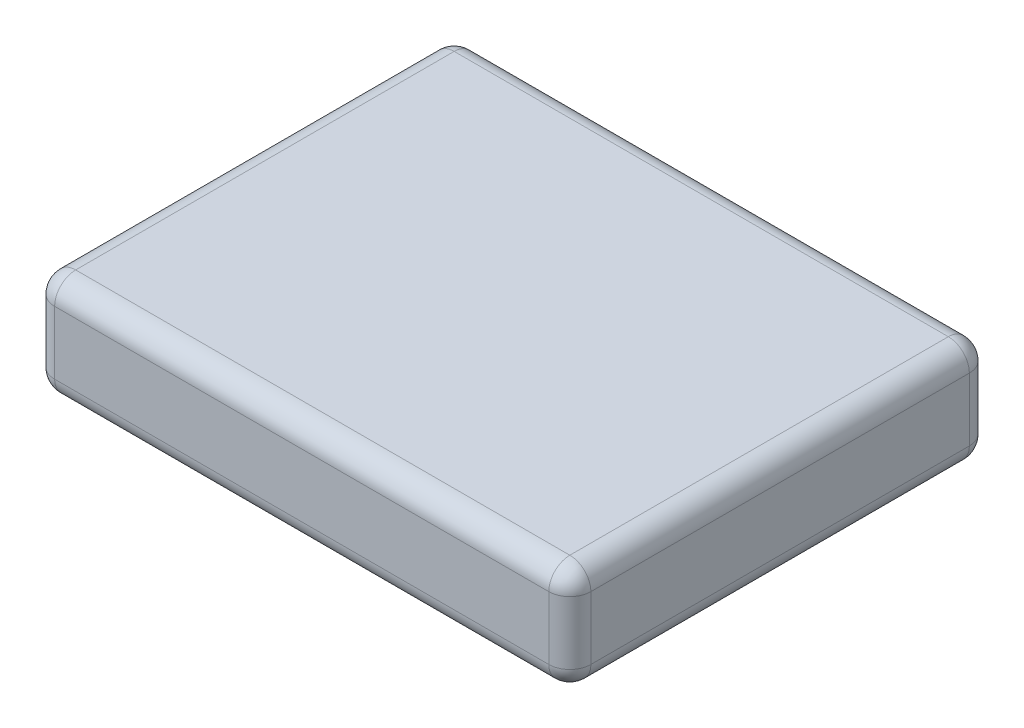
ISO-10303-21;
HEADER;
FILE_DESCRIPTION(('STEP AP214'),'2;1');
FILE_NAME('part.step','',(''),(''),'','','');
FILE_SCHEMA(('AUTOMOTIVE_DESIGN { 1 0 10303 214 1 1 1 1 }'));
ENDSEC;
DATA;
#1=APPLICATION_CONTEXT('core data for automotive mechanical design processes');
#2=APPLICATION_PROTOCOL_DEFINITION('international standard','automotive_design',2000,#1);
#3=PRODUCT_CONTEXT('',#1,'mechanical');
#4=PRODUCT('Part','Part','',(#3));
#5=PRODUCT_RELATED_PRODUCT_CATEGORY('part','',(#4));
#6=PRODUCT_DEFINITION_FORMATION('','',#4);
#7=PRODUCT_DEFINITION_CONTEXT('part definition',#1,'design');
#8=PRODUCT_DEFINITION('design','',#6,#7);
#9=PRODUCT_DEFINITION_SHAPE('','',#8);
#10=(LENGTH_UNIT() NAMED_UNIT(*) SI_UNIT(.MILLI.,.METRE.));
#11=(NAMED_UNIT(*) PLANE_ANGLE_UNIT() SI_UNIT($,.RADIAN.));
#12=(NAMED_UNIT(*) SI_UNIT($,.STERADIAN.) SOLID_ANGLE_UNIT());
#13=UNCERTAINTY_MEASURE_WITH_UNIT(LENGTH_MEASURE(1.E-05),#10,'distance_accuracy_value','');
#14=(GEOMETRIC_REPRESENTATION_CONTEXT(3) GLOBAL_UNCERTAINTY_ASSIGNED_CONTEXT((#13)) GLOBAL_UNIT_ASSIGNED_CONTEXT((#10,
#11,#12)) REPRESENTATION_CONTEXT('',''));
#15=CARTESIAN_POINT('',(0.,0.,0.));
#16=DIRECTION('',(0.,0.,1.));
#17=DIRECTION('',(1.,0.,0.));
#18=AXIS2_PLACEMENT_3D('',#15,#16,#17);
#19=CARTESIAN_POINT('',(12.75,5.,10.));
#20=DIRECTION('',(-1.,0.,0.));
#21=DIRECTION('',(0.,0.,1.));
#22=AXIS2_PLACEMENT_3D('',#19,#20,#21);
#23=PLANE('',#22);
#24=DIRECTION('',(0.,-1.,0.));
#25=VECTOR('',#24,1.);
#26=CARTESIAN_POINT('',(12.75,5.,9.));
#27=LINE('',#26,#25);
#28=CARTESIAN_POINT('',(12.75,4.,9.));
#29=VERTEX_POINT('',#28);
#30=CARTESIAN_POINT('',(12.75,1.,9.));
#31=VERTEX_POINT('',#30);
#32=EDGE_CURVE('E214',#29,#31,#27,.T.);
#33=ORIENTED_EDGE('',*,*,#32,.T.);
#34=DIRECTION('',(0.,0.,-1.));
#35=VECTOR('',#34,1.);
#36=CARTESIAN_POINT('',(12.75,1.,-10.));
#37=LINE('',#36,#35);
#38=CARTESIAN_POINT('',(12.75,1.,-9.));
#39=VERTEX_POINT('',#38);
#40=EDGE_CURVE('E218',#31,#39,#37,.T.);
#41=ORIENTED_EDGE('',*,*,#40,.T.);
#42=DIRECTION('',(0.,-1.,0.));
#43=VECTOR('',#42,1.);
#44=CARTESIAN_POINT('',(12.75,5.,-9.));
#45=LINE('',#44,#43);
#46=CARTESIAN_POINT('',(12.75,4.,-9.));
#47=VERTEX_POINT('',#46);
#48=EDGE_CURVE('E211',#39,#47,#45,.F.);
#49=ORIENTED_EDGE('',*,*,#48,.T.);
#50=DIRECTION('',(0.,0.,-1.));
#51=VECTOR('',#50,1.);
#52=CARTESIAN_POINT('',(12.75,4.,10.));
#53=LINE('',#52,#51);
#54=EDGE_CURVE('E208',#47,#29,#53,.F.);
#55=ORIENTED_EDGE('',*,*,#54,.T.);
#56=EDGE_LOOP('',(#33,#41,#49,#55));
#57=FACE_BOUND('',#56,.T.);
#58=ADVANCED_FACE('F45',(#57),#23,.F.);
#59=CARTESIAN_POINT('',(-12.75,5.,-10.));
#60=DIRECTION('',(0.,0.,1.));
#61=DIRECTION('',(1.,0.,0.));
#62=AXIS2_PLACEMENT_3D('',#59,#60,#61);
#63=PLANE('',#62);
#64=DIRECTION('',(0.,-1.,0.));
#65=VECTOR('',#64,1.);
#66=CARTESIAN_POINT('',(11.75,5.,-10.));
#67=LINE('',#66,#65);
#68=CARTESIAN_POINT('',(11.75,4.,-10.));
#69=VERTEX_POINT('',#68);
#70=CARTESIAN_POINT('',(11.75,1.,-10.));
#71=VERTEX_POINT('',#70);
#72=EDGE_CURVE('E187',#69,#71,#67,.T.);
#73=ORIENTED_EDGE('',*,*,#72,.T.);
#74=DIRECTION('',(-1.,0.,0.));
#75=VECTOR('',#74,1.);
#76=CARTESIAN_POINT('',(-12.75,1.,-10.));
#77=LINE('',#76,#75);
#78=CARTESIAN_POINT('',(-11.75,1.,-10.));
#79=VERTEX_POINT('',#78);
#80=EDGE_CURVE('E194',#71,#79,#77,.T.);
#81=ORIENTED_EDGE('',*,*,#80,.T.);
#82=DIRECTION('',(0.,-1.,0.));
#83=VECTOR('',#82,1.);
#84=CARTESIAN_POINT('',(-11.75,5.,-10.));
#85=LINE('',#84,#83);
#86=CARTESIAN_POINT('',(-11.75,4.,-10.));
#87=VERTEX_POINT('',#86);
#88=EDGE_CURVE('E190',#79,#87,#85,.F.);
#89=ORIENTED_EDGE('',*,*,#88,.T.);
#90=DIRECTION('',(-1.,0.,0.));
#91=VECTOR('',#90,1.);
#92=CARTESIAN_POINT('',(-12.75,4.,-10.));
#93=LINE('',#92,#91);
#94=EDGE_CURVE('E184',#87,#69,#93,.F.);
#95=ORIENTED_EDGE('',*,*,#94,.T.);
#96=EDGE_LOOP('',(#73,#81,#89,#95));
#97=FACE_BOUND('',#96,.T.);
#98=ADVANCED_FACE('F365',(#97),#63,.F.);
#99=CARTESIAN_POINT('',(-12.75,5.,10.));
#100=DIRECTION('',(1.,0.,0.));
#101=DIRECTION('',(0.,0.,-1.));
#102=AXIS2_PLACEMENT_3D('',#99,#100,#101);
#103=PLANE('',#102);
#104=DIRECTION('',(0.,-1.,0.));
#105=VECTOR('',#104,1.);
#106=CARTESIAN_POINT('',(-12.75,5.,-9.));
#107=LINE('',#106,#105);
#108=CARTESIAN_POINT('',(-12.75,4.,-9.));
#109=VERTEX_POINT('',#108);
#110=CARTESIAN_POINT('',(-12.75,1.,-9.));
#111=VERTEX_POINT('',#110);
#112=EDGE_CURVE('E146',#109,#111,#107,.T.);
#113=ORIENTED_EDGE('',*,*,#112,.T.);
#114=DIRECTION('',(0.,0.,1.));
#115=VECTOR('',#114,1.);
#116=CARTESIAN_POINT('',(-12.75,1.,10.));
#117=LINE('',#116,#115);
#118=CARTESIAN_POINT('',(-12.75,1.,9.));
#119=VERTEX_POINT('',#118);
#120=EDGE_CURVE('E141',#111,#119,#117,.T.);
#121=ORIENTED_EDGE('',*,*,#120,.T.);
#122=DIRECTION('',(0.,-1.,0.));
#123=VECTOR('',#122,1.);
#124=CARTESIAN_POINT('',(-12.75,5.,9.));
#125=LINE('',#124,#123);
#126=CARTESIAN_POINT('',(-12.75,4.,9.));
#127=VERTEX_POINT('',#126);
#128=EDGE_CURVE('E133',#119,#127,#125,.F.);
#129=ORIENTED_EDGE('',*,*,#128,.T.);
#130=DIRECTION('',(0.,0.,1.));
#131=VECTOR('',#130,1.);
#132=CARTESIAN_POINT('',(-12.75,4.,10.));
#133=LINE('',#132,#131);
#134=EDGE_CURVE('E138',#127,#109,#133,.F.);
#135=ORIENTED_EDGE('',*,*,#134,.T.);
#136=EDGE_LOOP('',(#113,#121,#129,#135));
#137=FACE_BOUND('',#136,.T.);
#138=ADVANCED_FACE('F136',(#137),#103,.F.);
#139=CARTESIAN_POINT('',(-12.75,5.,10.));
#140=DIRECTION('',(0.,0.,-1.));
#141=DIRECTION('',(-1.,0.,0.));
#142=AXIS2_PLACEMENT_3D('',#139,#140,#141);
#143=PLANE('',#142);
#144=DIRECTION('',(0.,-1.,0.));
#145=VECTOR('',#144,1.);
#146=CARTESIAN_POINT('',(-11.75,5.,10.));
#147=LINE('',#146,#145);
#148=CARTESIAN_POINT('',(-11.75,4.,10.));
#149=VERTEX_POINT('',#148);
#150=CARTESIAN_POINT('',(-11.75,1.,10.));
#151=VERTEX_POINT('',#150);
#152=EDGE_CURVE('E154',#149,#151,#147,.T.);
#153=ORIENTED_EDGE('',*,*,#152,.T.);
#154=DIRECTION('',(1.,0.,0.));
#155=VECTOR('',#154,1.);
#156=CARTESIAN_POINT('',(12.75,1.,10.));
#157=LINE('',#156,#155);
#158=CARTESIAN_POINT('',(11.75,1.,10.));
#159=VERTEX_POINT('',#158);
#160=EDGE_CURVE('E205',#151,#159,#157,.T.);
#161=ORIENTED_EDGE('',*,*,#160,.T.);
#162=DIRECTION('',(0.,-1.,0.));
#163=VECTOR('',#162,1.);
#164=CARTESIAN_POINT('',(11.75,5.,10.));
#165=LINE('',#164,#163);
#166=CARTESIAN_POINT('',(11.75,4.,10.));
#167=VERTEX_POINT('',#166);
#168=EDGE_CURVE('E200',#159,#167,#165,.F.);
#169=ORIENTED_EDGE('',*,*,#168,.T.);
#170=DIRECTION('',(1.,0.,0.));
#171=VECTOR('',#170,1.);
#172=CARTESIAN_POINT('',(-12.75,4.,10.));
#173=LINE('',#172,#171);
#174=EDGE_CURVE('E197',#167,#149,#173,.F.);
#175=ORIENTED_EDGE('',*,*,#174,.T.);
#176=EDGE_LOOP('',(#153,#161,#169,#175));
#177=FACE_BOUND('',#176,.T.);
#178=ADVANCED_FACE('F356',(#177),#143,.F.);
#179=CARTESIAN_POINT('',(0.,5.,0.));
#180=DIRECTION('',(0.,-1.,0.));
#181=DIRECTION('',(0.,0.,-1.));
#182=AXIS2_PLACEMENT_3D('',#179,#180,#181);
#183=PLANE('',#182);
#184=DIRECTION('',(0.,0.,1.));
#185=VECTOR('',#184,1.);
#186=CARTESIAN_POINT('',(-11.75,5.,0.));
#187=LINE('',#186,#185);
#188=CARTESIAN_POINT('',(-11.75,5.,-9.));
#189=VERTEX_POINT('',#188);
#190=CARTESIAN_POINT('',(-11.75,5.,9.));
#191=VERTEX_POINT('',#190);
#192=EDGE_CURVE('E55',#189,#191,#187,.T.);
#193=ORIENTED_EDGE('',*,*,#192,.T.);
#194=DIRECTION('',(1.,0.,0.));
#195=VECTOR('',#194,1.);
#196=CARTESIAN_POINT('',(0.,5.,9.));
#197=LINE('',#196,#195);
#198=CARTESIAN_POINT('',(11.75,5.,9.));
#199=VERTEX_POINT('',#198);
#200=EDGE_CURVE('E11',#191,#199,#197,.T.);
#201=ORIENTED_EDGE('',*,*,#200,.T.);
#202=DIRECTION('',(0.,0.,-1.));
#203=VECTOR('',#202,1.);
#204=CARTESIAN_POINT('',(11.75,5.,0.));
#205=LINE('',#204,#203);
#206=CARTESIAN_POINT('',(11.75,5.,-9.));
#207=VERTEX_POINT('',#206);
#208=EDGE_CURVE('E234',#199,#207,#205,.T.);
#209=ORIENTED_EDGE('',*,*,#208,.T.);
#210=DIRECTION('',(-1.,0.,0.));
#211=VECTOR('',#210,1.);
#212=CARTESIAN_POINT('',(0.,5.,-9.));
#213=LINE('',#212,#211);
#214=EDGE_CURVE('E66',#207,#189,#213,.T.);
#215=ORIENTED_EDGE('',*,*,#214,.T.);
#216=EDGE_LOOP('',(#193,#201,#209,#215));
#217=FACE_BOUND('',#216,.T.);
#218=ADVANCED_FACE('F358',(#217),#183,.F.);
#219=CARTESIAN_POINT('',(0.,0.,0.));
#220=DIRECTION('',(0.,-1.,0.));
#221=DIRECTION('',(0.,0.,-1.));
#222=AXIS2_PLACEMENT_3D('',#219,#220,#221);
#223=PLANE('',#222);
#224=DIRECTION('',(0.,0.,1.));
#225=VECTOR('',#224,1.);
#226=CARTESIAN_POINT('',(-11.75,0.,-10.));
#227=LINE('',#226,#225);
#228=CARTESIAN_POINT('',(-11.75,0.,9.));
#229=VERTEX_POINT('',#228);
#230=CARTESIAN_POINT('',(-11.75,0.,-9.));
#231=VERTEX_POINT('',#230);
#232=EDGE_CURVE('E227',#229,#231,#227,.F.);
#233=ORIENTED_EDGE('',*,*,#232,.T.);
#234=DIRECTION('',(-1.,0.,0.));
#235=VECTOR('',#234,1.);
#236=CARTESIAN_POINT('',(12.75,0.,-9.));
#237=LINE('',#236,#235);
#238=CARTESIAN_POINT('',(11.75,0.,-9.));
#239=VERTEX_POINT('',#238);
#240=EDGE_CURVE('E230',#231,#239,#237,.F.);
#241=ORIENTED_EDGE('',*,*,#240,.T.);
#242=DIRECTION('',(0.,0.,-1.));
#243=VECTOR('',#242,1.);
#244=CARTESIAN_POINT('',(11.75,0.,10.));
#245=LINE('',#244,#243);
#246=CARTESIAN_POINT('',(11.75,0.,9.));
#247=VERTEX_POINT('',#246);
#248=EDGE_CURVE('E221',#239,#247,#245,.F.);
#249=ORIENTED_EDGE('',*,*,#248,.T.);
#250=DIRECTION('',(1.,0.,0.));
#251=VECTOR('',#250,1.);
#252=CARTESIAN_POINT('',(-12.75,0.,9.));
#253=LINE('',#252,#251);
#254=EDGE_CURVE('E224',#247,#229,#253,.F.);
#255=ORIENTED_EDGE('',*,*,#254,.T.);
#256=EDGE_LOOP('',(#233,#241,#249,#255));
#257=FACE_BOUND('',#256,.T.);
#258=ADVANCED_FACE('F325',(#257),#223,.T.);
#259=CARTESIAN_POINT('',(11.75,5.,9.));
#260=DIRECTION('',(0.,-1.,0.));
#261=DIRECTION('',(0.,0.,-1.));
#262=AXIS2_PLACEMENT_3D('',#259,#260,#261);
#263=CYLINDRICAL_SURFACE('',#262,1.);
#264=CARTESIAN_POINT('',(11.75,4.,9.));
#265=DIRECTION('',(0.,1.,0.));
#266=DIRECTION('',(0.,0.,1.));
#267=AXIS2_PLACEMENT_3D('',#264,#265,#266);
#268=CIRCLE('',#267,1.);
#269=EDGE_CURVE('E49',#167,#29,#268,.T.);
#270=ORIENTED_EDGE('',*,*,#269,.F.);
#271=ORIENTED_EDGE('',*,*,#168,.F.);
#272=CARTESIAN_POINT('',(11.75,1.,9.));
#273=DIRECTION('',(0.,-1.,0.));
#274=DIRECTION('',(0.,0.,-1.));
#275=AXIS2_PLACEMENT_3D('',#272,#273,#274);
#276=CIRCLE('',#275,1.);
#277=EDGE_CURVE('E178',#31,#159,#276,.T.);
#278=ORIENTED_EDGE('',*,*,#277,.F.);
#279=ORIENTED_EDGE('',*,*,#32,.F.);
#280=EDGE_LOOP('',(#270,#271,#278,#279));
#281=FACE_BOUND('',#280,.T.);
#282=ADVANCED_FACE('F47',(#281),#263,.T.);
#283=CARTESIAN_POINT('',(11.75,4.,9.));
#284=DIRECTION('',(1.,0.,0.));
#285=DIRECTION('',(0.,0.,-1.));
#286=AXIS2_PLACEMENT_3D('',#283,#284,#285);
#287=SPHERICAL_SURFACE('',#286,1.);
#288=CARTESIAN_POINT('',(11.75,4.,9.));
#289=DIRECTION('',(1.,0.,0.));
#290=DIRECTION('',(0.,0.,-1.));
#291=AXIS2_PLACEMENT_3D('',#288,#289,#290);
#292=CIRCLE('',#291,1.);
#293=EDGE_CURVE('E301',#167,#199,#292,.F.);
#294=ORIENTED_EDGE('',*,*,#293,.F.);
#295=ORIENTED_EDGE('',*,*,#269,.T.);
#296=CARTESIAN_POINT('',(11.75,4.,9.));
#297=DIRECTION('',(0.,0.,1.));
#298=DIRECTION('',(1.,0.,0.));
#299=AXIS2_PLACEMENT_3D('',#296,#297,#298);
#300=CIRCLE('',#299,1.);
#301=EDGE_CURVE('E305',#199,#29,#300,.F.);
#302=ORIENTED_EDGE('',*,*,#301,.F.);
#303=EDGE_LOOP('',(#294,#295,#302));
#304=FACE_BOUND('',#303,.T.);
#305=ADVANCED_FACE('F351',(#304),#287,.T.);
#306=CARTESIAN_POINT('',(11.75,1.,9.));
#307=DIRECTION('',(0.,0.,1.));
#308=DIRECTION('',(1.,0.,0.));
#309=AXIS2_PLACEMENT_3D('',#306,#307,#308);
#310=SPHERICAL_SURFACE('',#309,1.);
#311=CARTESIAN_POINT('',(11.75,1.,9.));
#312=DIRECTION('',(0.,0.,1.));
#313=DIRECTION('',(1.,0.,0.));
#314=AXIS2_PLACEMENT_3D('',#311,#312,#313);
#315=CIRCLE('',#314,1.);
#316=EDGE_CURVE('E293',#31,#247,#315,.F.);
#317=ORIENTED_EDGE('',*,*,#316,.F.);
#318=ORIENTED_EDGE('',*,*,#277,.T.);
#319=CARTESIAN_POINT('',(11.75,1.,9.));
#320=DIRECTION('',(1.,0.,0.));
#321=DIRECTION('',(0.,0.,-1.));
#322=AXIS2_PLACEMENT_3D('',#319,#320,#321);
#323=CIRCLE('',#322,1.);
#324=EDGE_CURVE('E297',#247,#159,#323,.F.);
#325=ORIENTED_EDGE('',*,*,#324,.F.);
#326=EDGE_LOOP('',(#317,#318,#325));
#327=FACE_BOUND('',#326,.T.);
#328=ADVANCED_FACE('F314',(#327),#310,.T.);
#329=CARTESIAN_POINT('',(11.75,4.,0.));
#330=DIRECTION('',(0.,0.,-1.));
#331=DIRECTION('',(-1.,0.,0.));
#332=AXIS2_PLACEMENT_3D('',#329,#330,#331);
#333=CYLINDRICAL_SURFACE('',#332,1.);
#334=ORIENTED_EDGE('',*,*,#301,.T.);
#335=ORIENTED_EDGE('',*,*,#54,.F.);
#336=CARTESIAN_POINT('',(11.75,4.,-9.));
#337=DIRECTION('',(0.,0.,-1.));
#338=DIRECTION('',(-1.,0.,0.));
#339=AXIS2_PLACEMENT_3D('',#336,#337,#338);
#340=CIRCLE('',#339,1.);
#341=EDGE_CURVE('E285',#207,#47,#340,.T.);
#342=ORIENTED_EDGE('',*,*,#341,.F.);
#343=ORIENTED_EDGE('',*,*,#208,.F.);
#344=EDGE_LOOP('',(#334,#335,#342,#343));
#345=FACE_BOUND('',#344,.T.);
#346=ADVANCED_FACE('F346',(#345),#333,.T.);
#347=CARTESIAN_POINT('',(0.,4.,9.));
#348=DIRECTION('',(1.,0.,0.));
#349=DIRECTION('',(0.,0.,-1.));
#350=AXIS2_PLACEMENT_3D('',#347,#348,#349);
#351=CYLINDRICAL_SURFACE('',#350,1.);
#352=ORIENTED_EDGE('',*,*,#293,.T.);
#353=ORIENTED_EDGE('',*,*,#200,.F.);
#354=CARTESIAN_POINT('',(-11.75,4.,9.));
#355=DIRECTION('',(-1.,0.,0.));
#356=DIRECTION('',(0.,0.,1.));
#357=AXIS2_PLACEMENT_3D('',#354,#355,#356);
#358=CIRCLE('',#357,1.);
#359=EDGE_CURVE('E159',#149,#191,#358,.T.);
#360=ORIENTED_EDGE('',*,*,#359,.F.);
#361=ORIENTED_EDGE('',*,*,#174,.F.);
#362=EDGE_LOOP('',(#352,#353,#360,#361));
#363=FACE_BOUND('',#362,.T.);
#364=ADVANCED_FACE('F354',(#363),#351,.T.);
#365=CARTESIAN_POINT('',(-11.75,5.,9.));
#366=DIRECTION('',(0.,-1.,0.));
#367=DIRECTION('',(0.,0.,-1.));
#368=AXIS2_PLACEMENT_3D('',#365,#366,#367);
#369=CYLINDRICAL_SURFACE('',#368,1.);
#370=CARTESIAN_POINT('',(-11.75,1.,9.));
#371=DIRECTION('',(0.,-1.,0.));
#372=DIRECTION('',(0.,0.,-1.));
#373=AXIS2_PLACEMENT_3D('',#370,#371,#372);
#374=CIRCLE('',#373,1.);
#375=EDGE_CURVE('E160',#151,#119,#374,.T.);
#376=ORIENTED_EDGE('',*,*,#375,.F.);
#377=ORIENTED_EDGE('',*,*,#152,.F.);
#378=CARTESIAN_POINT('',(-11.75,4.,9.));
#379=DIRECTION('',(0.,1.,0.));
#380=DIRECTION('',(0.,0.,1.));
#381=AXIS2_PLACEMENT_3D('',#378,#379,#380);
#382=CIRCLE('',#381,1.);
#383=EDGE_CURVE('E150',#127,#149,#382,.T.);
#384=ORIENTED_EDGE('',*,*,#383,.F.);
#385=ORIENTED_EDGE('',*,*,#128,.F.);
#386=EDGE_LOOP('',(#376,#377,#384,#385));
#387=FACE_BOUND('',#386,.T.);
#388=ADVANCED_FACE('F152',(#387),#369,.T.);
#389=CARTESIAN_POINT('',(-12.75,1.,9.));
#390=DIRECTION('',(-1.,0.,0.));
#391=DIRECTION('',(0.,0.,1.));
#392=AXIS2_PLACEMENT_3D('',#389,#390,#391);
#393=CYLINDRICAL_SURFACE('',#392,1.);
#394=ORIENTED_EDGE('',*,*,#324,.T.);
#395=ORIENTED_EDGE('',*,*,#160,.F.);
#396=CARTESIAN_POINT('',(-11.75,1.,9.));
#397=DIRECTION('',(-1.,0.,0.));
#398=DIRECTION('',(0.,0.,1.));
#399=AXIS2_PLACEMENT_3D('',#396,#397,#398);
#400=CIRCLE('',#399,1.);
#401=EDGE_CURVE('E278',#229,#151,#400,.T.);
#402=ORIENTED_EDGE('',*,*,#401,.F.);
#403=ORIENTED_EDGE('',*,*,#254,.F.);
#404=EDGE_LOOP('',(#394,#395,#402,#403));
#405=FACE_BOUND('',#404,.T.);
#406=ADVANCED_FACE('F321',(#405),#393,.T.);
#407=CARTESIAN_POINT('',(11.75,1.,10.));
#408=DIRECTION('',(0.,0.,1.));
#409=DIRECTION('',(1.,0.,0.));
#410=AXIS2_PLACEMENT_3D('',#407,#408,#409);
#411=CYLINDRICAL_SURFACE('',#410,1.);
#412=ORIENTED_EDGE('',*,*,#316,.T.);
#413=ORIENTED_EDGE('',*,*,#248,.F.);
#414=CARTESIAN_POINT('',(11.75,1.,-9.));
#415=DIRECTION('',(0.,0.,-1.));
#416=DIRECTION('',(-1.,0.,0.));
#417=AXIS2_PLACEMENT_3D('',#414,#415,#416);
#418=CIRCLE('',#417,1.);
#419=EDGE_CURVE('E274',#39,#239,#418,.T.);
#420=ORIENTED_EDGE('',*,*,#419,.F.);
#421=ORIENTED_EDGE('',*,*,#40,.F.);
#422=EDGE_LOOP('',(#412,#413,#420,#421));
#423=FACE_BOUND('',#422,.T.);
#424=ADVANCED_FACE('F331',(#423),#411,.T.);
#425=CARTESIAN_POINT('',(11.75,5.,-9.));
#426=DIRECTION('',(0.,-1.,0.));
#427=DIRECTION('',(0.,0.,-1.));
#428=AXIS2_PLACEMENT_3D('',#425,#426,#427);
#429=CYLINDRICAL_SURFACE('',#428,1.);
#430=CARTESIAN_POINT('',(11.75,4.,-9.));
#431=DIRECTION('',(0.,1.,0.));
#432=DIRECTION('',(0.,0.,1.));
#433=AXIS2_PLACEMENT_3D('',#430,#431,#432);
#434=CIRCLE('',#433,1.);
#435=EDGE_CURVE('E289',#47,#69,#434,.T.);
#436=ORIENTED_EDGE('',*,*,#435,.F.);
#437=ORIENTED_EDGE('',*,*,#48,.F.);
#438=CARTESIAN_POINT('',(11.75,1.,-9.));
#439=DIRECTION('',(0.,-1.,0.));
#440=DIRECTION('',(0.,0.,-1.));
#441=AXIS2_PLACEMENT_3D('',#438,#439,#440);
#442=CIRCLE('',#441,1.);
#443=EDGE_CURVE('E270',#71,#39,#442,.T.);
#444=ORIENTED_EDGE('',*,*,#443,.F.);
#445=ORIENTED_EDGE('',*,*,#72,.F.);
#446=EDGE_LOOP('',(#436,#437,#444,#445));
#447=FACE_BOUND('',#446,.T.);
#448=ADVANCED_FACE('F338',(#447),#429,.T.);
#449=CARTESIAN_POINT('',(11.75,4.,-9.));
#450=DIRECTION('',(1.,0.,0.));
#451=DIRECTION('',(0.,0.,-1.));
#452=AXIS2_PLACEMENT_3D('',#449,#450,#451);
#453=SPHERICAL_SURFACE('',#452,1.);
#454=ORIENTED_EDGE('',*,*,#341,.T.);
#455=ORIENTED_EDGE('',*,*,#435,.T.);
#456=CARTESIAN_POINT('',(11.75,4.,-9.));
#457=DIRECTION('',(1.,0.,0.));
#458=DIRECTION('',(0.,0.,-1.));
#459=AXIS2_PLACEMENT_3D('',#456,#457,#458);
#460=CIRCLE('',#459,1.);
#461=EDGE_CURVE('E167',#207,#69,#460,.F.);
#462=ORIENTED_EDGE('',*,*,#461,.F.);
#463=EDGE_LOOP('',(#454,#455,#462));
#464=FACE_BOUND('',#463,.T.);
#465=ADVANCED_FACE('F344',(#464),#453,.T.);
#466=CARTESIAN_POINT('',(-11.75,4.,9.));
#467=DIRECTION('',(0.,0.,1.));
#468=DIRECTION('',(1.,0.,0.));
#469=AXIS2_PLACEMENT_3D('',#466,#467,#468);
#470=SPHERICAL_SURFACE('',#469,1.);
#471=ORIENTED_EDGE('',*,*,#383,.T.);
#472=ORIENTED_EDGE('',*,*,#359,.T.);
#473=CARTESIAN_POINT('',(-11.75,4.,9.));
#474=DIRECTION('',(0.,0.,1.));
#475=DIRECTION('',(1.,0.,0.));
#476=AXIS2_PLACEMENT_3D('',#473,#474,#475);
#477=CIRCLE('',#476,1.);
#478=EDGE_CURVE('E163',#127,#191,#477,.F.);
#479=ORIENTED_EDGE('',*,*,#478,.F.);
#480=EDGE_LOOP('',(#471,#472,#479));
#481=FACE_BOUND('',#480,.T.);
#482=ADVANCED_FACE('F164',(#481),#470,.T.);
#483=CARTESIAN_POINT('',(-11.75,1.,9.));
#484=DIRECTION('',(0.,0.,1.));
#485=DIRECTION('',(1.,0.,0.));
#486=AXIS2_PLACEMENT_3D('',#483,#484,#485);
#487=SPHERICAL_SURFACE('',#486,1.);
#488=ORIENTED_EDGE('',*,*,#401,.T.);
#489=ORIENTED_EDGE('',*,*,#375,.T.);
#490=CARTESIAN_POINT('',(-11.75,1.,9.));
#491=DIRECTION('',(0.,0.,1.));
#492=DIRECTION('',(1.,0.,0.));
#493=AXIS2_PLACEMENT_3D('',#490,#491,#492);
#494=CIRCLE('',#493,1.);
#495=EDGE_CURVE('E168',#229,#119,#494,.F.);
#496=ORIENTED_EDGE('',*,*,#495,.F.);
#497=EDGE_LOOP('',(#488,#489,#496));
#498=FACE_BOUND('',#497,.T.);
#499=ADVANCED_FACE('F405',(#498),#487,.T.);
#500=CARTESIAN_POINT('',(11.75,1.,-9.));
#501=DIRECTION('',(1.,0.,0.));
#502=DIRECTION('',(0.,0.,-1.));
#503=AXIS2_PLACEMENT_3D('',#500,#501,#502);
#504=SPHERICAL_SURFACE('',#503,1.);
#505=ORIENTED_EDGE('',*,*,#443,.T.);
#506=ORIENTED_EDGE('',*,*,#419,.T.);
#507=CARTESIAN_POINT('',(11.75,1.,-9.));
#508=DIRECTION('',(1.,0.,0.));
#509=DIRECTION('',(0.,0.,-1.));
#510=AXIS2_PLACEMENT_3D('',#507,#508,#509);
#511=CIRCLE('',#510,1.);
#512=EDGE_CURVE('E261',#71,#239,#511,.F.);
#513=ORIENTED_EDGE('',*,*,#512,.F.);
#514=EDGE_LOOP('',(#505,#506,#513));
#515=FACE_BOUND('',#514,.T.);
#516=ADVANCED_FACE('F401',(#515),#504,.T.);
#517=CARTESIAN_POINT('',(0.,4.,-9.));
#518=DIRECTION('',(-1.,0.,0.));
#519=DIRECTION('',(0.,0.,1.));
#520=AXIS2_PLACEMENT_3D('',#517,#518,#519);
#521=CYLINDRICAL_SURFACE('',#520,1.);
#522=ORIENTED_EDGE('',*,*,#461,.T.);
#523=ORIENTED_EDGE('',*,*,#94,.F.);
#524=CARTESIAN_POINT('',(-11.75,4.,-9.));
#525=DIRECTION('',(-1.,0.,0.));
#526=DIRECTION('',(0.,0.,1.));
#527=AXIS2_PLACEMENT_3D('',#524,#525,#526);
#528=CIRCLE('',#527,1.);
#529=EDGE_CURVE('E257',#189,#87,#528,.T.);
#530=ORIENTED_EDGE('',*,*,#529,.F.);
#531=ORIENTED_EDGE('',*,*,#214,.F.);
#532=EDGE_LOOP('',(#522,#523,#530,#531));
#533=FACE_BOUND('',#532,.T.);
#534=ADVANCED_FACE('F398',(#533),#521,.T.);
#535=CARTESIAN_POINT('',(-11.75,4.,0.));
#536=DIRECTION('',(0.,0.,1.));
#537=DIRECTION('',(1.,0.,0.));
#538=AXIS2_PLACEMENT_3D('',#535,#536,#537);
#539=CYLINDRICAL_SURFACE('',#538,1.);
#540=ORIENTED_EDGE('',*,*,#478,.T.);
#541=ORIENTED_EDGE('',*,*,#192,.F.);
#542=CARTESIAN_POINT('',(-11.75,4.,-9.));
#543=DIRECTION('',(0.,0.,-1.));
#544=DIRECTION('',(-1.,0.,0.));
#545=AXIS2_PLACEMENT_3D('',#542,#543,#544);
#546=CIRCLE('',#545,1.);
#547=EDGE_CURVE('E172',#109,#189,#546,.T.);
#548=ORIENTED_EDGE('',*,*,#547,.F.);
#549=ORIENTED_EDGE('',*,*,#134,.F.);
#550=EDGE_LOOP('',(#540,#541,#548,#549));
#551=FACE_BOUND('',#550,.T.);
#552=ADVANCED_FACE('F170',(#551),#539,.T.);
#553=CARTESIAN_POINT('',(-11.75,1.,10.));
#554=DIRECTION('',(0.,0.,-1.));
#555=DIRECTION('',(-1.,0.,0.));
#556=AXIS2_PLACEMENT_3D('',#553,#554,#555);
#557=CYLINDRICAL_SURFACE('',#556,1.);
#558=ORIENTED_EDGE('',*,*,#495,.T.);
#559=ORIENTED_EDGE('',*,*,#120,.F.);
#560=CARTESIAN_POINT('',(-11.75,1.,-9.));
#561=DIRECTION('',(0.,0.,-1.));
#562=DIRECTION('',(-1.,0.,0.));
#563=AXIS2_PLACEMENT_3D('',#560,#561,#562);
#564=CIRCLE('',#563,1.);
#565=EDGE_CURVE('E251',#231,#111,#564,.T.);
#566=ORIENTED_EDGE('',*,*,#565,.F.);
#567=ORIENTED_EDGE('',*,*,#232,.F.);
#568=EDGE_LOOP('',(#558,#559,#566,#567));
#569=FACE_BOUND('',#568,.T.);
#570=ADVANCED_FACE('F391',(#569),#557,.T.);
#571=CARTESIAN_POINT('',(-12.75,1.,-9.));
#572=DIRECTION('',(1.,0.,0.));
#573=DIRECTION('',(0.,0.,-1.));
#574=AXIS2_PLACEMENT_3D('',#571,#572,#573);
#575=CYLINDRICAL_SURFACE('',#574,1.);
#576=ORIENTED_EDGE('',*,*,#512,.T.);
#577=ORIENTED_EDGE('',*,*,#240,.F.);
#578=CARTESIAN_POINT('',(-11.75,1.,-9.));
#579=DIRECTION('',(-1.,0.,0.));
#580=DIRECTION('',(0.,0.,1.));
#581=AXIS2_PLACEMENT_3D('',#578,#579,#580);
#582=CIRCLE('',#581,1.);
#583=EDGE_CURVE('E247',#79,#231,#582,.T.);
#584=ORIENTED_EDGE('',*,*,#583,.F.);
#585=ORIENTED_EDGE('',*,*,#80,.F.);
#586=EDGE_LOOP('',(#576,#577,#584,#585));
#587=FACE_BOUND('',#586,.T.);
#588=ADVANCED_FACE('F387',(#587),#575,.T.);
#589=CARTESIAN_POINT('',(-11.75,4.,-9.));
#590=DIRECTION('',(0.,1.,0.));
#591=DIRECTION('',(0.,0.,1.));
#592=AXIS2_PLACEMENT_3D('',#589,#590,#591);
#593=SPHERICAL_SURFACE('',#592,1.);
#594=ORIENTED_EDGE('',*,*,#547,.T.);
#595=ORIENTED_EDGE('',*,*,#529,.T.);
#596=CARTESIAN_POINT('',(-11.75,4.,-9.));
#597=DIRECTION('',(0.,1.,0.));
#598=DIRECTION('',(0.,0.,1.));
#599=AXIS2_PLACEMENT_3D('',#596,#597,#598);
#600=CIRCLE('',#599,1.);
#601=EDGE_CURVE('E244',#109,#87,#600,.F.);
#602=ORIENTED_EDGE('',*,*,#601,.F.);
#603=EDGE_LOOP('',(#594,#595,#602));
#604=FACE_BOUND('',#603,.T.);
#605=ADVANCED_FACE('F383',(#604),#593,.T.);
#606=CARTESIAN_POINT('',(-11.75,1.,-9.));
#607=DIRECTION('',(0.,-1.,0.));
#608=DIRECTION('',(0.,0.,-1.));
#609=AXIS2_PLACEMENT_3D('',#606,#607,#608);
#610=SPHERICAL_SURFACE('',#609,1.);
#611=ORIENTED_EDGE('',*,*,#583,.T.);
#612=ORIENTED_EDGE('',*,*,#565,.T.);
#613=CARTESIAN_POINT('',(-11.75,1.,-9.));
#614=DIRECTION('',(0.,-1.,0.));
#615=DIRECTION('',(0.,0.,-1.));
#616=AXIS2_PLACEMENT_3D('',#613,#614,#615);
#617=CIRCLE('',#616,1.);
#618=EDGE_CURVE('E241',#79,#111,#617,.F.);
#619=ORIENTED_EDGE('',*,*,#618,.F.);
#620=EDGE_LOOP('',(#611,#612,#619));
#621=FACE_BOUND('',#620,.T.);
#622=ADVANCED_FACE('F379',(#621),#610,.T.);
#623=CARTESIAN_POINT('',(-11.75,5.,-9.));
#624=DIRECTION('',(0.,-1.,0.));
#625=DIRECTION('',(0.,0.,-1.));
#626=AXIS2_PLACEMENT_3D('',#623,#624,#625);
#627=CYLINDRICAL_SURFACE('',#626,1.);
#628=ORIENTED_EDGE('',*,*,#601,.T.);
#629=ORIENTED_EDGE('',*,*,#88,.F.);
#630=ORIENTED_EDGE('',*,*,#618,.T.);
#631=ORIENTED_EDGE('',*,*,#112,.F.);
#632=EDGE_LOOP('',(#628,#629,#630,#631));
#633=FACE_BOUND('',#632,.T.);
#634=ADVANCED_FACE('F376',(#633),#627,.T.);
#635=CLOSED_SHELL('',(#58,#98,#138,#178,#218,#258,#282,#305,#328,#346,#364,#388,#406,#424,#448,
#465,#482,#499,#516,#534,#552,#570,#588,#605,#622,#634));
#636=MANIFOLD_SOLID_BREP('B2',#635);
#637=ADVANCED_BREP_SHAPE_REPRESENTATION('',(#18,#636),#14);
#638=SHAPE_DEFINITION_REPRESENTATION(#9,#637);
ENDSEC;
END-ISO-10303-21;
